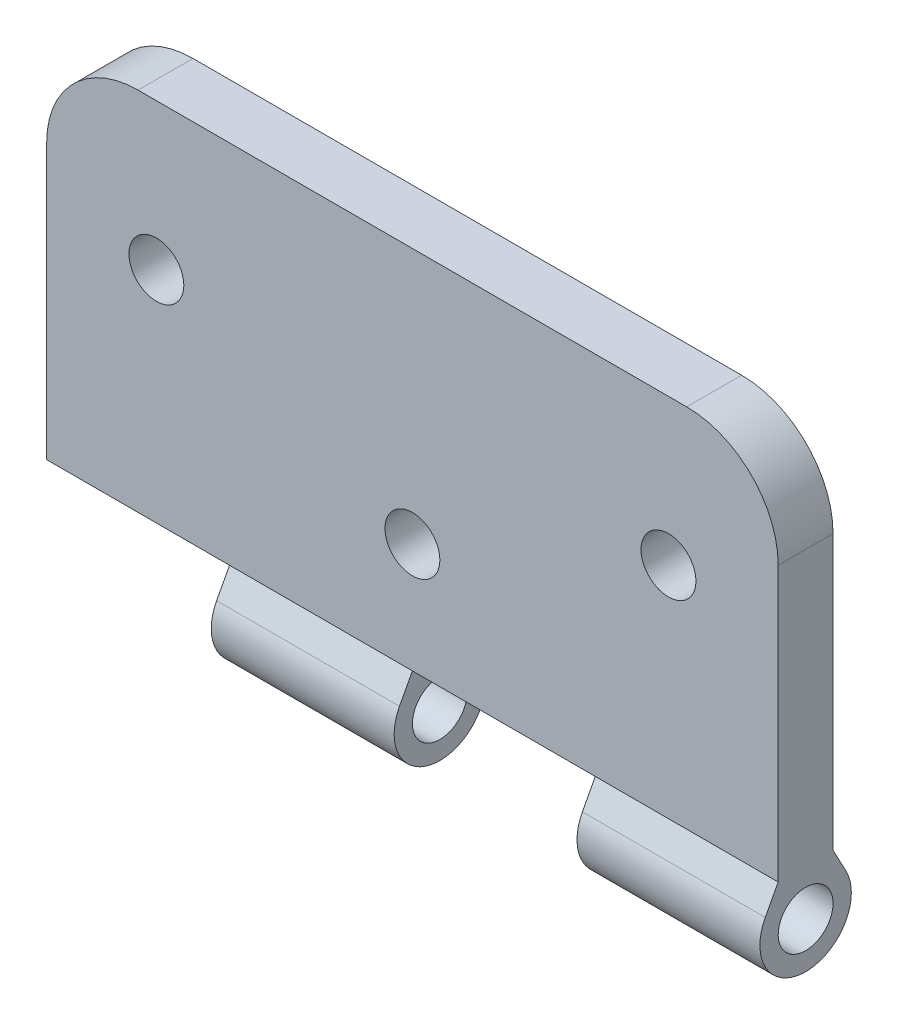
ISO-10303-21;
HEADER;
FILE_DESCRIPTION(('STEP AP214'),'2;1');
FILE_NAME('part.step','',(''),(''),'','','');
FILE_SCHEMA(('AUTOMOTIVE_DESIGN { 1 0 10303 214 1 1 1 1 }'));
ENDSEC;
DATA;
#1=APPLICATION_CONTEXT('core data for automotive mechanical design processes');
#2=APPLICATION_PROTOCOL_DEFINITION('international standard','automotive_design',2000,#1);
#3=PRODUCT_CONTEXT('',#1,'mechanical');
#4=PRODUCT('Part','Part','',(#3));
#5=PRODUCT_RELATED_PRODUCT_CATEGORY('part','',(#4));
#6=PRODUCT_DEFINITION_FORMATION('','',#4);
#7=PRODUCT_DEFINITION_CONTEXT('part definition',#1,'design');
#8=PRODUCT_DEFINITION('design','',#6,#7);
#9=PRODUCT_DEFINITION_SHAPE('','',#8);
#10=(LENGTH_UNIT() NAMED_UNIT(*) SI_UNIT(.MILLI.,.METRE.));
#11=(NAMED_UNIT(*) PLANE_ANGLE_UNIT() SI_UNIT($,.RADIAN.));
#12=(NAMED_UNIT(*) SI_UNIT($,.STERADIAN.) SOLID_ANGLE_UNIT());
#13=UNCERTAINTY_MEASURE_WITH_UNIT(LENGTH_MEASURE(1.E-05),#10,'distance_accuracy_value','');
#14=(GEOMETRIC_REPRESENTATION_CONTEXT(3) GLOBAL_UNCERTAINTY_ASSIGNED_CONTEXT((#13)) GLOBAL_UNIT_ASSIGNED_CONTEXT((#10,
#11,#12)) REPRESENTATION_CONTEXT('',''));
#15=CARTESIAN_POINT('',(0.,0.,0.));
#16=DIRECTION('',(0.,0.,1.));
#17=DIRECTION('',(1.,0.,0.));
#18=AXIS2_PLACEMENT_3D('',#15,#16,#17);
#19=CARTESIAN_POINT('',(-20.,-10.,3.));
#20=DIRECTION('',(0.,1.,0.));
#21=DIRECTION('',(0.,0.,1.));
#22=AXIS2_PLACEMENT_3D('',#19,#20,#21);
#23=PLANE('',#22);
#24=DIRECTION('',(0.,0.,1.));
#25=VECTOR('',#24,1.);
#26=CARTESIAN_POINT('',(-10.,-10.,3.));
#27=LINE('',#26,#25);
#28=CARTESIAN_POINT('',(-10.,-10.,0.));
#29=VERTEX_POINT('',#28);
#30=CARTESIAN_POINT('',(-10.,-10.,3.));
#31=VERTEX_POINT('',#30);
#32=EDGE_CURVE('E64',#29,#31,#27,.T.);
#33=ORIENTED_EDGE('',*,*,#32,.T.);
#34=DIRECTION('',(1.,0.,0.));
#35=VECTOR('',#34,1.);
#36=CARTESIAN_POINT('',(-20.,-10.,3.));
#37=LINE('',#36,#35);
#38=CARTESIAN_POINT('',(-20.,-10.,3.));
#39=VERTEX_POINT('',#38);
#40=EDGE_CURVE('E260',#39,#31,#37,.T.);
#41=ORIENTED_EDGE('',*,*,#40,.F.);
#42=DIRECTION('',(0.,0.,-1.));
#43=VECTOR('',#42,1.);
#44=CARTESIAN_POINT('',(-20.,-10.,3.));
#45=LINE('',#44,#43);
#46=CARTESIAN_POINT('',(-20.,-10.,0.));
#47=VERTEX_POINT('',#46);
#48=EDGE_CURVE('E263',#39,#47,#45,.T.);
#49=ORIENTED_EDGE('',*,*,#48,.T.);
#50=DIRECTION('',(1.,0.,0.));
#51=VECTOR('',#50,1.);
#52=CARTESIAN_POINT('',(-20.,-10.,0.));
#53=LINE('',#52,#51);
#54=EDGE_CURVE('E248',#47,#29,#53,.T.);
#55=ORIENTED_EDGE('',*,*,#54,.T.);
#56=EDGE_LOOP('',(#33,#41,#49,#55));
#57=FACE_BOUND('',#56,.T.);
#58=ADVANCED_FACE('F38',(#57),#23,.F.);
#59=CARTESIAN_POINT('',(20.,4.99999999999996,3.));
#60=DIRECTION('',(-1.,0.,0.));
#61=DIRECTION('',(0.,-1.,0.));
#62=AXIS2_PLACEMENT_3D('',#59,#60,#61);
#63=PLANE('',#62);
#64=DIRECTION('',(0.,1.,0.));
#65=VECTOR('',#64,1.);
#66=CARTESIAN_POINT('',(20.,4.99999999999996,0.));
#67=LINE('',#66,#65);
#68=CARTESIAN_POINT('',(20.,-10.,0.));
#69=VERTEX_POINT('',#68);
#70=CARTESIAN_POINT('',(20.,4.99999999999997,0.));
#71=VERTEX_POINT('',#70);
#72=EDGE_CURVE('E233',#69,#71,#67,.T.);
#73=ORIENTED_EDGE('',*,*,#72,.T.);
#74=DIRECTION('',(0.,0.,-1.));
#75=VECTOR('',#74,1.);
#76=CARTESIAN_POINT('',(20.,4.99999999999997,3.));
#77=LINE('',#76,#75);
#78=CARTESIAN_POINT('',(20.,4.99999999999997,3.));
#79=VERTEX_POINT('',#78);
#80=EDGE_CURVE('E11',#79,#71,#77,.T.);
#81=ORIENTED_EDGE('',*,*,#80,.F.);
#82=DIRECTION('',(0.,1.,0.));
#83=VECTOR('',#82,1.);
#84=CARTESIAN_POINT('',(20.,4.99999999999996,3.));
#85=LINE('',#84,#83);
#86=CARTESIAN_POINT('',(20.,-10.,3.));
#87=VERTEX_POINT('',#86);
#88=EDGE_CURVE('E243',#87,#79,#85,.T.);
#89=ORIENTED_EDGE('',*,*,#88,.F.);
#90=DIRECTION('',(0.,-0.88235294117647,0.470588235294119));
#91=VECTOR('',#90,1.);
#92=CARTESIAN_POINT('',(20.,-10.,3.));
#93=LINE('',#92,#91);
#94=CARTESIAN_POINT('',(20.,-11.3235294117647,3.70588235294118));
#95=VERTEX_POINT('',#94);
#96=EDGE_CURVE('E199',#87,#95,#93,.T.);
#97=ORIENTED_EDGE('',*,*,#96,.T.);
#98=CARTESIAN_POINT('',(20.,-12.5,1.5));
#99=DIRECTION('',(1.,0.,0.));
#100=DIRECTION('',(0.,1.,0.));
#101=AXIS2_PLACEMENT_3D('',#98,#99,#100);
#102=CIRCLE('',#101,2.5);
#103=CARTESIAN_POINT('',(20.,-11.3235294117647,-0.705882352941178));
#104=VERTEX_POINT('',#103);
#105=EDGE_CURVE('E223',#95,#104,#102,.T.);
#106=ORIENTED_EDGE('',*,*,#105,.T.);
#107=DIRECTION('',(0.,0.88235294117647,0.470588235294119));
#108=VECTOR('',#107,1.);
#109=CARTESIAN_POINT('',(20.,-10.,0.));
#110=LINE('',#109,#108);
#111=EDGE_CURVE('E207',#104,#69,#110,.T.);
#112=ORIENTED_EDGE('',*,*,#111,.T.);
#113=EDGE_LOOP('',(#73,#81,#89,#97,#106,#112));
#114=FACE_BOUND('',#113,.T.);
#115=CARTESIAN_POINT('',(20.,-12.5,1.5));
#116=DIRECTION('',(1.,0.,0.));
#117=DIRECTION('',(0.,1.,0.));
#118=AXIS2_PLACEMENT_3D('',#115,#116,#117);
#119=CIRCLE('',#118,1.5);
#120=CARTESIAN_POINT('',(20.,-11.,1.5));
#121=VERTEX_POINT('',#120);
#122=EDGE_CURVE('E190',#121,#121,#119,.T.);
#123=ORIENTED_EDGE('',*,*,#122,.F.);
#124=EDGE_LOOP('',(#123));
#125=FACE_BOUND('',#124,.T.);
#126=ADVANCED_FACE('F40',(#114,#125),#63,.F.);
#127=CARTESIAN_POINT('',(15.,5.,3.));
#128=DIRECTION('',(0.,0.,-1.));
#129=DIRECTION('',(-1.,0.,0.));
#130=AXIS2_PLACEMENT_3D('',#127,#128,#129);
#131=CYLINDRICAL_SURFACE('',#130,5.);
#132=CARTESIAN_POINT('',(15.,5.,0.));
#133=DIRECTION('',(0.,0.,1.));
#134=DIRECTION('',(-1.,0.,0.));
#135=AXIS2_PLACEMENT_3D('',#132,#133,#134);
#136=CIRCLE('',#135,5.);
#137=CARTESIAN_POINT('',(15.,10.,0.));
#138=VERTEX_POINT('',#137);
#139=EDGE_CURVE('E267',#71,#138,#136,.T.);
#140=ORIENTED_EDGE('',*,*,#139,.T.);
#141=DIRECTION('',(0.,0.,-1.));
#142=VECTOR('',#141,1.);
#143=CARTESIAN_POINT('',(15.,10.,3.));
#144=LINE('',#143,#142);
#145=CARTESIAN_POINT('',(15.,10.,3.));
#146=VERTEX_POINT('',#145);
#147=EDGE_CURVE('E48',#146,#138,#144,.T.);
#148=ORIENTED_EDGE('',*,*,#147,.F.);
#149=CARTESIAN_POINT('',(15.,5.,3.));
#150=DIRECTION('',(0.,0.,1.));
#151=DIRECTION('',(-1.,0.,0.));
#152=AXIS2_PLACEMENT_3D('',#149,#150,#151);
#153=CIRCLE('',#152,5.);
#154=EDGE_CURVE('E247',#79,#146,#153,.T.);
#155=ORIENTED_EDGE('',*,*,#154,.F.);
#156=ORIENTED_EDGE('',*,*,#80,.T.);
#157=EDGE_LOOP('',(#140,#148,#155,#156));
#158=FACE_BOUND('',#157,.T.);
#159=ADVANCED_FACE('F351',(#158),#131,.T.);
#160=CARTESIAN_POINT('',(-15.,10.,3.));
#161=DIRECTION('',(0.,-1.,0.));
#162=DIRECTION('',(0.,0.,-1.));
#163=AXIS2_PLACEMENT_3D('',#160,#161,#162);
#164=PLANE('',#163);
#165=DIRECTION('',(-1.,0.,0.));
#166=VECTOR('',#165,1.);
#167=CARTESIAN_POINT('',(-15.,10.,0.));
#168=LINE('',#167,#166);
#169=CARTESIAN_POINT('',(-15.,10.,0.));
#170=VERTEX_POINT('',#169);
#171=EDGE_CURVE('E270',#138,#170,#168,.T.);
#172=ORIENTED_EDGE('',*,*,#171,.T.);
#173=DIRECTION('',(0.,0.,-1.));
#174=VECTOR('',#173,1.);
#175=CARTESIAN_POINT('',(-15.,10.,3.));
#176=LINE('',#175,#174);
#177=CARTESIAN_POINT('',(-15.,10.,3.));
#178=VERTEX_POINT('',#177);
#179=EDGE_CURVE('E289',#178,#170,#176,.T.);
#180=ORIENTED_EDGE('',*,*,#179,.F.);
#181=DIRECTION('',(-1.,0.,0.));
#182=VECTOR('',#181,1.);
#183=CARTESIAN_POINT('',(-15.,10.,3.));
#184=LINE('',#183,#182);
#185=EDGE_CURVE('E251',#146,#178,#184,.T.);
#186=ORIENTED_EDGE('',*,*,#185,.F.);
#187=ORIENTED_EDGE('',*,*,#147,.T.);
#188=EDGE_LOOP('',(#172,#180,#186,#187));
#189=FACE_BOUND('',#188,.T.);
#190=ADVANCED_FACE('F356',(#189),#164,.F.);
#191=CARTESIAN_POINT('',(-15.,5.,3.));
#192=DIRECTION('',(0.,0.,-1.));
#193=DIRECTION('',(-1.,0.,0.));
#194=AXIS2_PLACEMENT_3D('',#191,#192,#193);
#195=CYLINDRICAL_SURFACE('',#194,5.);
#196=CARTESIAN_POINT('',(-15.,5.,0.));
#197=DIRECTION('',(0.,0.,1.));
#198=DIRECTION('',(1.,0.,0.));
#199=AXIS2_PLACEMENT_3D('',#196,#197,#198);
#200=CIRCLE('',#199,5.);
#201=CARTESIAN_POINT('',(-20.,4.99999999999996,0.));
#202=VERTEX_POINT('',#201);
#203=EDGE_CURVE('E273',#170,#202,#200,.T.);
#204=ORIENTED_EDGE('',*,*,#203,.T.);
#205=DIRECTION('',(0.,0.,-1.));
#206=VECTOR('',#205,1.);
#207=CARTESIAN_POINT('',(-20.,4.99999999999996,3.));
#208=LINE('',#207,#206);
#209=CARTESIAN_POINT('',(-20.,4.99999999999996,3.));
#210=VERTEX_POINT('',#209);
#211=EDGE_CURVE('E285',#210,#202,#208,.T.);
#212=ORIENTED_EDGE('',*,*,#211,.F.);
#213=CARTESIAN_POINT('',(-15.,5.,3.));
#214=DIRECTION('',(0.,0.,1.));
#215=DIRECTION('',(1.,0.,0.));
#216=AXIS2_PLACEMENT_3D('',#213,#214,#215);
#217=CIRCLE('',#216,5.);
#218=EDGE_CURVE('E254',#178,#210,#217,.T.);
#219=ORIENTED_EDGE('',*,*,#218,.F.);
#220=ORIENTED_EDGE('',*,*,#179,.T.);
#221=EDGE_LOOP('',(#204,#212,#219,#220));
#222=FACE_BOUND('',#221,.T.);
#223=ADVANCED_FACE('F362',(#222),#195,.T.);
#224=CARTESIAN_POINT('',(-20.,4.99999999999996,3.));
#225=DIRECTION('',(1.,0.,0.));
#226=DIRECTION('',(0.,0.,-1.));
#227=AXIS2_PLACEMENT_3D('',#224,#225,#226);
#228=PLANE('',#227);
#229=DIRECTION('',(0.,-1.,0.));
#230=VECTOR('',#229,1.);
#231=CARTESIAN_POINT('',(-20.,4.99999999999996,0.));
#232=LINE('',#231,#230);
#233=EDGE_CURVE('E276',#202,#47,#232,.T.);
#234=ORIENTED_EDGE('',*,*,#233,.T.);
#235=ORIENTED_EDGE('',*,*,#48,.F.);
#236=DIRECTION('',(0.,-1.,0.));
#237=VECTOR('',#236,1.);
#238=CARTESIAN_POINT('',(-20.,4.99999999999996,3.));
#239=LINE('',#238,#237);
#240=EDGE_CURVE('E257',#210,#39,#239,.T.);
#241=ORIENTED_EDGE('',*,*,#240,.F.);
#242=ORIENTED_EDGE('',*,*,#211,.T.);
#243=EDGE_LOOP('',(#234,#235,#241,#242));
#244=FACE_BOUND('',#243,.T.);
#245=ADVANCED_FACE('F366',(#244),#228,.F.);
#246=CARTESIAN_POINT('',(0.,-10.,3.));
#247=VERTEX_POINT('',#246);
#248=CARTESIAN_POINT('',(10.,-10.,3.));
#249=VERTEX_POINT('',#248);
#250=EDGE_CURVE('E56',#247,#249,#37,.T.);
#251=ORIENTED_EDGE('',*,*,#250,.F.);
#252=DIRECTION('',(0.,0.,1.));
#253=VECTOR('',#252,1.);
#254=CARTESIAN_POINT('',(0.,-10.,3.));
#255=LINE('',#254,#253);
#256=CARTESIAN_POINT('',(0.,-10.,0.));
#257=VERTEX_POINT('',#256);
#258=EDGE_CURVE('E173',#257,#247,#255,.T.);
#259=ORIENTED_EDGE('',*,*,#258,.F.);
#260=CARTESIAN_POINT('',(10.,-10.,0.));
#261=VERTEX_POINT('',#260);
#262=EDGE_CURVE('E279',#257,#261,#53,.T.);
#263=ORIENTED_EDGE('',*,*,#262,.T.);
#264=DIRECTION('',(0.,0.,1.));
#265=VECTOR('',#264,1.);
#266=CARTESIAN_POINT('',(10.,-10.,3.));
#267=LINE('',#266,#265);
#268=EDGE_CURVE('E203',#261,#249,#267,.T.);
#269=ORIENTED_EDGE('',*,*,#268,.T.);
#270=EDGE_LOOP('',(#251,#259,#263,#269));
#271=FACE_BOUND('',#270,.T.);
#272=ADVANCED_FACE('F337',(#271),#23,.F.);
#273=CARTESIAN_POINT('',(-15.,5.,3.));
#274=DIRECTION('',(0.,0.,1.));
#275=DIRECTION('',(1.,0.,0.));
#276=AXIS2_PLACEMENT_3D('',#273,#274,#275);
#277=PLANE('',#276);
#278=CARTESIAN_POINT('',(0.,-4.,3.));
#279=DIRECTION('',(0.,0.,1.));
#280=DIRECTION('',(1.,0.,0.));
#281=AXIS2_PLACEMENT_3D('',#278,#279,#280);
#282=CIRCLE('',#281,1.5);
#283=CARTESIAN_POINT('',(1.5,-4.,3.));
#284=VERTEX_POINT('',#283);
#285=EDGE_CURVE('E300',#284,#284,#282,.T.);
#286=ORIENTED_EDGE('',*,*,#285,.F.);
#287=EDGE_LOOP('',(#286));
#288=FACE_BOUND('',#287,.T.);
#289=CARTESIAN_POINT('',(-14.,2.,3.));
#290=DIRECTION('',(0.,0.,1.));
#291=DIRECTION('',(1.,0.,0.));
#292=AXIS2_PLACEMENT_3D('',#289,#290,#291);
#293=CIRCLE('',#292,1.5);
#294=CARTESIAN_POINT('',(-12.5,2.,3.));
#295=VERTEX_POINT('',#294);
#296=EDGE_CURVE('E322',#295,#295,#293,.T.);
#297=ORIENTED_EDGE('',*,*,#296,.F.);
#298=EDGE_LOOP('',(#297));
#299=FACE_BOUND('',#298,.T.);
#300=CARTESIAN_POINT('',(14.,2.,3.));
#301=DIRECTION('',(0.,0.,1.));
#302=DIRECTION('',(-1.,0.,0.));
#303=AXIS2_PLACEMENT_3D('',#300,#301,#302);
#304=CIRCLE('',#303,1.5);
#305=CARTESIAN_POINT('',(12.5,2.,3.));
#306=VERTEX_POINT('',#305);
#307=EDGE_CURVE('E318',#306,#306,#304,.T.);
#308=ORIENTED_EDGE('',*,*,#307,.F.);
#309=EDGE_LOOP('',(#308));
#310=FACE_BOUND('',#309,.T.);
#311=ORIENTED_EDGE('',*,*,#88,.T.);
#312=ORIENTED_EDGE('',*,*,#154,.T.);
#313=ORIENTED_EDGE('',*,*,#185,.T.);
#314=ORIENTED_EDGE('',*,*,#218,.T.);
#315=ORIENTED_EDGE('',*,*,#240,.T.);
#316=ORIENTED_EDGE('',*,*,#40,.T.);
#317=DIRECTION('',(1.,0.,0.));
#318=VECTOR('',#317,1.);
#319=CARTESIAN_POINT('',(-10.,-10.,3.));
#320=LINE('',#319,#318);
#321=EDGE_CURVE('E152',#31,#247,#320,.T.);
#322=ORIENTED_EDGE('',*,*,#321,.T.);
#323=ORIENTED_EDGE('',*,*,#250,.T.);
#324=DIRECTION('',(1.,0.,0.));
#325=VECTOR('',#324,1.);
#326=CARTESIAN_POINT('',(10.,-10.,3.));
#327=LINE('',#326,#325);
#328=EDGE_CURVE('E219',#249,#87,#327,.T.);
#329=ORIENTED_EDGE('',*,*,#328,.T.);
#330=EDGE_LOOP('',(#311,#312,#313,#314,#315,#316,#322,#323,#329));
#331=FACE_BOUND('',#330,.T.);
#332=ADVANCED_FACE('F333',(#288,#299,#310,#331),#277,.T.);
#333=CARTESIAN_POINT('',(-15.,5.,0.));
#334=DIRECTION('',(0.,0.,1.));
#335=DIRECTION('',(1.,0.,0.));
#336=AXIS2_PLACEMENT_3D('',#333,#334,#335);
#337=PLANE('',#336);
#338=CARTESIAN_POINT('',(0.,-4.,0.));
#339=DIRECTION('',(0.,0.,1.));
#340=DIRECTION('',(1.,0.,0.));
#341=AXIS2_PLACEMENT_3D('',#338,#339,#340);
#342=CIRCLE('',#341,1.5);
#343=CARTESIAN_POINT('',(1.5,-4.,0.));
#344=VERTEX_POINT('',#343);
#345=EDGE_CURVE('E42',#344,#344,#342,.T.);
#346=ORIENTED_EDGE('',*,*,#345,.T.);
#347=EDGE_LOOP('',(#346));
#348=FACE_BOUND('',#347,.T.);
#349=CARTESIAN_POINT('',(-14.,2.,0.));
#350=DIRECTION('',(0.,0.,1.));
#351=DIRECTION('',(1.,0.,0.));
#352=AXIS2_PLACEMENT_3D('',#349,#350,#351);
#353=CIRCLE('',#352,1.5);
#354=CARTESIAN_POINT('',(-12.5,2.,0.));
#355=VERTEX_POINT('',#354);
#356=EDGE_CURVE('E299',#355,#355,#353,.T.);
#357=ORIENTED_EDGE('',*,*,#356,.T.);
#358=EDGE_LOOP('',(#357));
#359=FACE_BOUND('',#358,.T.);
#360=CARTESIAN_POINT('',(14.,2.,0.));
#361=DIRECTION('',(0.,0.,1.));
#362=DIRECTION('',(1.,0.,0.));
#363=AXIS2_PLACEMENT_3D('',#360,#361,#362);
#364=CIRCLE('',#363,1.5);
#365=CARTESIAN_POINT('',(15.5,2.,0.));
#366=VERTEX_POINT('',#365);
#367=EDGE_CURVE('E296',#366,#366,#364,.T.);
#368=ORIENTED_EDGE('',*,*,#367,.T.);
#369=EDGE_LOOP('',(#368));
#370=FACE_BOUND('',#369,.T.);
#371=ORIENTED_EDGE('',*,*,#72,.F.);
#372=DIRECTION('',(1.,0.,0.));
#373=VECTOR('',#372,1.);
#374=CARTESIAN_POINT('',(10.,-10.,0.));
#375=LINE('',#374,#373);
#376=EDGE_CURVE('E230',#261,#69,#375,.T.);
#377=ORIENTED_EDGE('',*,*,#376,.F.);
#378=ORIENTED_EDGE('',*,*,#262,.F.);
#379=DIRECTION('',(1.,0.,0.));
#380=VECTOR('',#379,1.);
#381=CARTESIAN_POINT('',(-10.,-10.,0.));
#382=LINE('',#381,#380);
#383=EDGE_CURVE('E186',#29,#257,#382,.T.);
#384=ORIENTED_EDGE('',*,*,#383,.F.);
#385=ORIENTED_EDGE('',*,*,#54,.F.);
#386=ORIENTED_EDGE('',*,*,#233,.F.);
#387=ORIENTED_EDGE('',*,*,#203,.F.);
#388=ORIENTED_EDGE('',*,*,#171,.F.);
#389=ORIENTED_EDGE('',*,*,#139,.F.);
#390=EDGE_LOOP('',(#371,#377,#378,#384,#385,#386,#387,#388,#389));
#391=FACE_BOUND('',#390,.T.);
#392=ADVANCED_FACE('F336',(#348,#359,#370,#391),#337,.F.);
#393=CARTESIAN_POINT('',(10.,-10.,0.));
#394=DIRECTION('',(0.,0.470588235294119,-0.88235294117647));
#395=DIRECTION('',(0.,0.88235294117647,0.470588235294119));
#396=AXIS2_PLACEMENT_3D('',#393,#394,#395);
#397=PLANE('',#396);
#398=ORIENTED_EDGE('',*,*,#111,.F.);
#399=DIRECTION('',(1.,0.,0.));
#400=VECTOR('',#399,1.);
#401=CARTESIAN_POINT('',(10.,-11.3235294117647,-0.705882352941178));
#402=LINE('',#401,#400);
#403=CARTESIAN_POINT('',(10.,-11.3235294117647,-0.705882352941178));
#404=VERTEX_POINT('',#403);
#405=EDGE_CURVE('E234',#404,#104,#402,.T.);
#406=ORIENTED_EDGE('',*,*,#405,.F.);
#407=DIRECTION('',(0.,0.88235294117647,0.470588235294119));
#408=VECTOR('',#407,1.);
#409=CARTESIAN_POINT('',(10.,-10.,0.));
#410=LINE('',#409,#408);
#411=EDGE_CURVE('E215',#404,#261,#410,.T.);
#412=ORIENTED_EDGE('',*,*,#411,.T.);
#413=ORIENTED_EDGE('',*,*,#376,.T.);
#414=EDGE_LOOP('',(#398,#406,#412,#413));
#415=FACE_BOUND('',#414,.T.);
#416=ADVANCED_FACE('F381',(#415),#397,.T.);
#417=CARTESIAN_POINT('',(10.,-12.5,1.5));
#418=DIRECTION('',(1.,0.,0.));
#419=DIRECTION('',(0.,1.,0.));
#420=AXIS2_PLACEMENT_3D('',#417,#418,#419);
#421=CYLINDRICAL_SURFACE('',#420,2.5);
#422=ORIENTED_EDGE('',*,*,#105,.F.);
#423=DIRECTION('',(1.,0.,0.));
#424=VECTOR('',#423,1.);
#425=CARTESIAN_POINT('',(10.,-11.3235294117647,3.70588235294118));
#426=LINE('',#425,#424);
#427=CARTESIAN_POINT('',(10.,-11.3235294117647,3.70588235294118));
#428=VERTEX_POINT('',#427);
#429=EDGE_CURVE('E237',#428,#95,#426,.T.);
#430=ORIENTED_EDGE('',*,*,#429,.F.);
#431=CARTESIAN_POINT('',(10.,-12.5,1.5));
#432=DIRECTION('',(1.,0.,0.));
#433=DIRECTION('',(0.,1.,0.));
#434=AXIS2_PLACEMENT_3D('',#431,#432,#433);
#435=CIRCLE('',#434,2.5);
#436=EDGE_CURVE('E211',#428,#404,#435,.T.);
#437=ORIENTED_EDGE('',*,*,#436,.T.);
#438=ORIENTED_EDGE('',*,*,#405,.T.);
#439=EDGE_LOOP('',(#422,#430,#437,#438));
#440=FACE_BOUND('',#439,.T.);
#441=ADVANCED_FACE('F385',(#440),#421,.T.);
#442=CARTESIAN_POINT('',(10.,-10.,3.));
#443=DIRECTION('',(0.,0.470588235294119,0.88235294117647));
#444=DIRECTION('',(0.,-0.88235294117647,0.470588235294119));
#445=AXIS2_PLACEMENT_3D('',#442,#443,#444);
#446=PLANE('',#445);
#447=ORIENTED_EDGE('',*,*,#96,.F.);
#448=ORIENTED_EDGE('',*,*,#328,.F.);
#449=DIRECTION('',(0.,-0.88235294117647,0.470588235294119));
#450=VECTOR('',#449,1.);
#451=CARTESIAN_POINT('',(10.,-10.,3.));
#452=LINE('',#451,#450);
#453=EDGE_CURVE('E206',#249,#428,#452,.T.);
#454=ORIENTED_EDGE('',*,*,#453,.T.);
#455=ORIENTED_EDGE('',*,*,#429,.T.);
#456=EDGE_LOOP('',(#447,#448,#454,#455));
#457=FACE_BOUND('',#456,.T.);
#458=ADVANCED_FACE('F390',(#457),#446,.T.);
#459=CARTESIAN_POINT('',(10.,-12.5,1.5));
#460=DIRECTION('',(1.,0.,0.));
#461=DIRECTION('',(0.,1.,0.));
#462=AXIS2_PLACEMENT_3D('',#459,#460,#461);
#463=PLANE('',#462);
#464=CARTESIAN_POINT('',(10.,-12.5,1.5));
#465=DIRECTION('',(1.,0.,0.));
#466=DIRECTION('',(0.,1.,0.));
#467=AXIS2_PLACEMENT_3D('',#464,#465,#466);
#468=CIRCLE('',#467,1.5);
#469=CARTESIAN_POINT('',(10.,-11.,1.5));
#470=VERTEX_POINT('',#469);
#471=EDGE_CURVE('E195',#470,#470,#468,.T.);
#472=ORIENTED_EDGE('',*,*,#471,.T.);
#473=EDGE_LOOP('',(#472));
#474=FACE_BOUND('',#473,.T.);
#475=ORIENTED_EDGE('',*,*,#268,.F.);
#476=ORIENTED_EDGE('',*,*,#411,.F.);
#477=ORIENTED_EDGE('',*,*,#436,.F.);
#478=ORIENTED_EDGE('',*,*,#453,.F.);
#479=EDGE_LOOP('',(#475,#476,#477,#478));
#480=FACE_BOUND('',#479,.T.);
#481=ADVANCED_FACE('F388',(#474,#480),#463,.F.);
#482=CARTESIAN_POINT('',(10.,-12.5,1.5));
#483=DIRECTION('',(1.,0.,0.));
#484=DIRECTION('',(0.,1.,0.));
#485=AXIS2_PLACEMENT_3D('',#482,#483,#484);
#486=CYLINDRICAL_SURFACE('',#485,1.5);
#487=ORIENTED_EDGE('',*,*,#471,.F.);
#488=EDGE_LOOP('',(#487));
#489=FACE_BOUND('',#488,.T.);
#490=ORIENTED_EDGE('',*,*,#122,.T.);
#491=EDGE_LOOP('',(#490));
#492=FACE_BOUND('',#491,.T.);
#493=ADVANCED_FACE('F397',(#489,#492),#486,.F.);
#494=CARTESIAN_POINT('',(-10.,-10.,0.));
#495=DIRECTION('',(0.,0.470588235294119,-0.88235294117647));
#496=DIRECTION('',(0.,0.88235294117647,0.470588235294119));
#497=AXIS2_PLACEMENT_3D('',#494,#495,#496);
#498=PLANE('',#497);
#499=DIRECTION('',(0.,0.88235294117647,0.470588235294119));
#500=VECTOR('',#499,1.);
#501=CARTESIAN_POINT('',(0.,-10.,0.));
#502=LINE('',#501,#500);
#503=CARTESIAN_POINT('',(0.,-11.3235294117647,-0.705882352941178));
#504=VERTEX_POINT('',#503);
#505=EDGE_CURVE('E167',#504,#257,#502,.T.);
#506=ORIENTED_EDGE('',*,*,#505,.F.);
#507=DIRECTION('',(1.,0.,0.));
#508=VECTOR('',#507,1.);
#509=CARTESIAN_POINT('',(-10.,-11.3235294117647,-0.705882352941178));
#510=LINE('',#509,#508);
#511=CARTESIAN_POINT('',(-10.,-11.3235294117647,-0.705882352941178));
#512=VERTEX_POINT('',#511);
#513=EDGE_CURVE('E151',#512,#504,#510,.T.);
#514=ORIENTED_EDGE('',*,*,#513,.F.);
#515=DIRECTION('',(0.,0.88235294117647,0.470588235294119));
#516=VECTOR('',#515,1.);
#517=CARTESIAN_POINT('',(-10.,-10.,0.));
#518=LINE('',#517,#516);
#519=EDGE_CURVE('E159',#512,#29,#518,.T.);
#520=ORIENTED_EDGE('',*,*,#519,.T.);
#521=ORIENTED_EDGE('',*,*,#383,.T.);
#522=EDGE_LOOP('',(#506,#514,#520,#521));
#523=FACE_BOUND('',#522,.T.);
#524=ADVANCED_FACE('F374',(#523),#498,.T.);
#525=CARTESIAN_POINT('',(-10.,-12.5,1.5));
#526=DIRECTION('',(1.,0.,0.));
#527=DIRECTION('',(0.,1.,0.));
#528=AXIS2_PLACEMENT_3D('',#525,#526,#527);
#529=CYLINDRICAL_SURFACE('',#528,2.5);
#530=CARTESIAN_POINT('',(0.,-12.5,1.5));
#531=DIRECTION('',(1.,0.,0.));
#532=DIRECTION('',(0.,1.,0.));
#533=AXIS2_PLACEMENT_3D('',#530,#531,#532);
#534=CIRCLE('',#533,2.5);
#535=CARTESIAN_POINT('',(0.,-11.3235294117647,3.70588235294118));
#536=VERTEX_POINT('',#535);
#537=EDGE_CURVE('E145',#536,#504,#534,.T.);
#538=ORIENTED_EDGE('',*,*,#537,.F.);
#539=DIRECTION('',(1.,0.,0.));
#540=VECTOR('',#539,1.);
#541=CARTESIAN_POINT('',(-10.,-11.3235294117647,3.70588235294118));
#542=LINE('',#541,#540);
#543=CARTESIAN_POINT('',(-10.,-11.3235294117647,3.70588235294118));
#544=VERTEX_POINT('',#543);
#545=EDGE_CURVE('E139',#544,#536,#542,.T.);
#546=ORIENTED_EDGE('',*,*,#545,.F.);
#547=CARTESIAN_POINT('',(-10.,-12.5,1.5));
#548=DIRECTION('',(1.,0.,0.));
#549=DIRECTION('',(0.,1.,0.));
#550=AXIS2_PLACEMENT_3D('',#547,#548,#549);
#551=CIRCLE('',#550,2.5);
#552=EDGE_CURVE('E142',#544,#512,#551,.T.);
#553=ORIENTED_EDGE('',*,*,#552,.T.);
#554=ORIENTED_EDGE('',*,*,#513,.T.);
#555=EDGE_LOOP('',(#538,#546,#553,#554));
#556=FACE_BOUND('',#555,.T.);
#557=ADVANCED_FACE('F141',(#556),#529,.T.);
#558=CARTESIAN_POINT('',(-10.,-10.,3.));
#559=DIRECTION('',(0.,0.470588235294119,0.88235294117647));
#560=DIRECTION('',(0.,-0.88235294117647,0.470588235294119));
#561=AXIS2_PLACEMENT_3D('',#558,#559,#560);
#562=PLANE('',#561);
#563=DIRECTION('',(0.,-0.88235294117647,0.470588235294119));
#564=VECTOR('',#563,1.);
#565=CARTESIAN_POINT('',(0.,-10.,3.));
#566=LINE('',#565,#564);
#567=EDGE_CURVE('E177',#247,#536,#566,.T.);
#568=ORIENTED_EDGE('',*,*,#567,.F.);
#569=ORIENTED_EDGE('',*,*,#321,.F.);
#570=DIRECTION('',(0.,-0.88235294117647,0.470588235294119));
#571=VECTOR('',#570,1.);
#572=CARTESIAN_POINT('',(-10.,-10.,3.));
#573=LINE('',#572,#571);
#574=EDGE_CURVE('E157',#31,#544,#573,.T.);
#575=ORIENTED_EDGE('',*,*,#574,.T.);
#576=ORIENTED_EDGE('',*,*,#545,.T.);
#577=EDGE_LOOP('',(#568,#569,#575,#576));
#578=FACE_BOUND('',#577,.T.);
#579=ADVANCED_FACE('F163',(#578),#562,.T.);
#580=CARTESIAN_POINT('',(-10.,-12.5,1.5));
#581=DIRECTION('',(1.,0.,0.));
#582=DIRECTION('',(0.,1.,0.));
#583=AXIS2_PLACEMENT_3D('',#580,#581,#582);
#584=PLANE('',#583);
#585=CARTESIAN_POINT('',(-10.,-12.5,1.5));
#586=DIRECTION('',(1.,0.,0.));
#587=DIRECTION('',(0.,1.,0.));
#588=AXIS2_PLACEMENT_3D('',#585,#586,#587);
#589=CIRCLE('',#588,1.5);
#590=CARTESIAN_POINT('',(-10.,-11.,1.5));
#591=VERTEX_POINT('',#590);
#592=EDGE_CURVE('E178',#591,#591,#589,.T.);
#593=ORIENTED_EDGE('',*,*,#592,.T.);
#594=EDGE_LOOP('',(#593));
#595=FACE_BOUND('',#594,.T.);
#596=ORIENTED_EDGE('',*,*,#32,.F.);
#597=ORIENTED_EDGE('',*,*,#519,.F.);
#598=ORIENTED_EDGE('',*,*,#552,.F.);
#599=ORIENTED_EDGE('',*,*,#574,.F.);
#600=EDGE_LOOP('',(#596,#597,#598,#599));
#601=FACE_BOUND('',#600,.T.);
#602=ADVANCED_FACE('F156',(#595,#601),#584,.F.);
#603=CARTESIAN_POINT('',(0.,-12.5,1.5));
#604=DIRECTION('',(1.,0.,0.));
#605=DIRECTION('',(0.,1.,0.));
#606=AXIS2_PLACEMENT_3D('',#603,#604,#605);
#607=PLANE('',#606);
#608=CARTESIAN_POINT('',(0.,-12.5,1.5));
#609=DIRECTION('',(1.,0.,0.));
#610=DIRECTION('',(0.,1.,0.));
#611=AXIS2_PLACEMENT_3D('',#608,#609,#610);
#612=CIRCLE('',#611,1.5);
#613=CARTESIAN_POINT('',(0.,-11.,1.5));
#614=VERTEX_POINT('',#613);
#615=EDGE_CURVE('E307',#614,#614,#612,.T.);
#616=ORIENTED_EDGE('',*,*,#615,.F.);
#617=EDGE_LOOP('',(#616));
#618=FACE_BOUND('',#617,.T.);
#619=ORIENTED_EDGE('',*,*,#258,.T.);
#620=ORIENTED_EDGE('',*,*,#567,.T.);
#621=ORIENTED_EDGE('',*,*,#537,.T.);
#622=ORIENTED_EDGE('',*,*,#505,.T.);
#623=EDGE_LOOP('',(#619,#620,#621,#622));
#624=FACE_BOUND('',#623,.T.);
#625=ADVANCED_FACE('F370',(#618,#624),#607,.T.);
#626=CARTESIAN_POINT('',(-10.,-12.5,1.5));
#627=DIRECTION('',(1.,0.,0.));
#628=DIRECTION('',(0.,1.,0.));
#629=AXIS2_PLACEMENT_3D('',#626,#627,#628);
#630=CYLINDRICAL_SURFACE('',#629,1.5);
#631=ORIENTED_EDGE('',*,*,#592,.F.);
#632=EDGE_LOOP('',(#631));
#633=FACE_BOUND('',#632,.T.);
#634=ORIENTED_EDGE('',*,*,#615,.T.);
#635=EDGE_LOOP('',(#634));
#636=FACE_BOUND('',#635,.T.);
#637=ADVANCED_FACE('F527',(#633,#636),#630,.F.);
#638=CARTESIAN_POINT('',(14.,2.,-7.));
#639=DIRECTION('',(0.,0.,1.));
#640=DIRECTION('',(1.,0.,0.));
#641=AXIS2_PLACEMENT_3D('',#638,#639,#640);
#642=CYLINDRICAL_SURFACE('',#641,1.5);
#643=ORIENTED_EDGE('',*,*,#307,.T.);
#644=EDGE_LOOP('',(#643));
#645=FACE_BOUND('',#644,.T.);
#646=ORIENTED_EDGE('',*,*,#367,.F.);
#647=EDGE_LOOP('',(#646));
#648=FACE_BOUND('',#647,.T.);
#649=ADVANCED_FACE('F536',(#645,#648),#642,.F.);
#650=CARTESIAN_POINT('',(-14.,2.,-7.));
#651=DIRECTION('',(0.,0.,1.));
#652=DIRECTION('',(1.,0.,0.));
#653=AXIS2_PLACEMENT_3D('',#650,#651,#652);
#654=CYLINDRICAL_SURFACE('',#653,1.5);
#655=ORIENTED_EDGE('',*,*,#296,.T.);
#656=EDGE_LOOP('',(#655));
#657=FACE_BOUND('',#656,.T.);
#658=ORIENTED_EDGE('',*,*,#356,.F.);
#659=EDGE_LOOP('',(#658));
#660=FACE_BOUND('',#659,.T.);
#661=ADVANCED_FACE('F552',(#657,#660),#654,.F.);
#662=CARTESIAN_POINT('',(0.,-4.,-7.));
#663=DIRECTION('',(0.,0.,1.));
#664=DIRECTION('',(1.,0.,0.));
#665=AXIS2_PLACEMENT_3D('',#662,#663,#664);
#666=CYLINDRICAL_SURFACE('',#665,1.5);
#667=ORIENTED_EDGE('',*,*,#285,.T.);
#668=EDGE_LOOP('',(#667));
#669=FACE_BOUND('',#668,.T.);
#670=ORIENTED_EDGE('',*,*,#345,.F.);
#671=EDGE_LOOP('',(#670));
#672=FACE_BOUND('',#671,.T.);
#673=ADVANCED_FACE('F330',(#669,#672),#666,.F.);
#674=CLOSED_SHELL('',(#58,#126,#159,#190,#223,#245,#272,#332,#392,#416,#441,#458,#481,#493,#524,
#557,#579,#602,#625,#637,#649,#661,#673));
#675=MANIFOLD_SOLID_BREP('B2',#674);
#676=ADVANCED_BREP_SHAPE_REPRESENTATION('',(#18,#675),#14);
#677=SHAPE_DEFINITION_REPRESENTATION(#9,#676);
ENDSEC;
END-ISO-10303-21;
